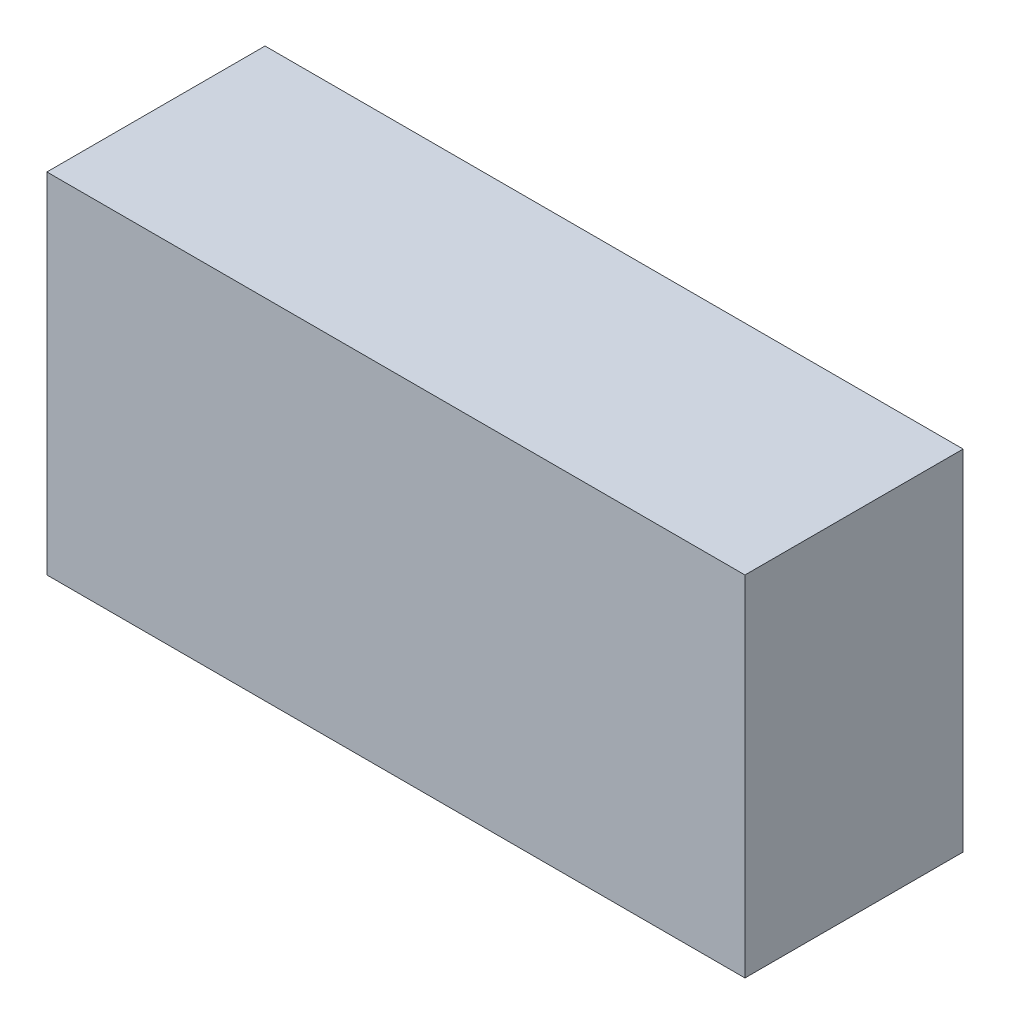
ISO-10303-21;
HEADER;
FILE_DESCRIPTION(('STEP AP214'),'2;1');
FILE_NAME('part.step','',(''),(''),'','','');
FILE_SCHEMA(('AUTOMOTIVE_DESIGN { 1 0 10303 214 1 1 1 1 }'));
ENDSEC;
DATA;
#1=APPLICATION_CONTEXT('core data for automotive mechanical design processes');
#2=APPLICATION_PROTOCOL_DEFINITION('international standard','automotive_design',2000,#1);
#3=PRODUCT_CONTEXT('',#1,'mechanical');
#4=PRODUCT('Part','Part','',(#3));
#5=PRODUCT_RELATED_PRODUCT_CATEGORY('part','',(#4));
#6=PRODUCT_DEFINITION_FORMATION('','',#4);
#7=PRODUCT_DEFINITION_CONTEXT('part definition',#1,'design');
#8=PRODUCT_DEFINITION('design','',#6,#7);
#9=PRODUCT_DEFINITION_SHAPE('','',#8);
#10=(LENGTH_UNIT() NAMED_UNIT(*) SI_UNIT(.MILLI.,.METRE.));
#11=(NAMED_UNIT(*) PLANE_ANGLE_UNIT() SI_UNIT($,.RADIAN.));
#12=(NAMED_UNIT(*) SI_UNIT($,.STERADIAN.) SOLID_ANGLE_UNIT());
#13=UNCERTAINTY_MEASURE_WITH_UNIT(LENGTH_MEASURE(1.E-05),#10,'distance_accuracy_value','');
#14=(GEOMETRIC_REPRESENTATION_CONTEXT(3) GLOBAL_UNCERTAINTY_ASSIGNED_CONTEXT((#13)) GLOBAL_UNIT_ASSIGNED_CONTEXT((#10,
#11,#12)) REPRESENTATION_CONTEXT('',''));
#15=CARTESIAN_POINT('',(0.,0.,0.));
#16=DIRECTION('',(0.,0.,1.));
#17=DIRECTION('',(1.,0.,0.));
#18=AXIS2_PLACEMENT_3D('',#15,#16,#17);
#19=CARTESIAN_POINT('',(0.8,0.4,0.5));
#20=DIRECTION('',(-1.,0.,0.));
#21=DIRECTION('',(0.,0.,1.));
#22=AXIS2_PLACEMENT_3D('',#19,#20,#21);
#23=PLANE('',#22);
#24=DIRECTION('',(0.,1.,0.));
#25=VECTOR('',#24,1.);
#26=CARTESIAN_POINT('',(0.8,0.4,0.));
#27=LINE('',#26,#25);
#28=CARTESIAN_POINT('',(0.8,-0.4,0.));
#29=VERTEX_POINT('',#28);
#30=CARTESIAN_POINT('',(0.8,0.4,0.));
#31=VERTEX_POINT('',#30);
#32=EDGE_CURVE('E96',#29,#31,#27,.T.);
#33=ORIENTED_EDGE('',*,*,#32,.T.);
#34=DIRECTION('',(0.,0.,-1.));
#35=VECTOR('',#34,1.);
#36=CARTESIAN_POINT('',(0.8,0.4,0.5));
#37=LINE('',#36,#35);
#38=CARTESIAN_POINT('',(0.8,0.4,0.5));
#39=VERTEX_POINT('',#38);
#40=EDGE_CURVE('E11',#39,#31,#37,.T.);
#41=ORIENTED_EDGE('',*,*,#40,.F.);
#42=DIRECTION('',(0.,1.,0.));
#43=VECTOR('',#42,1.);
#44=CARTESIAN_POINT('',(0.8,0.4,0.5));
#45=LINE('',#44,#43);
#46=CARTESIAN_POINT('',(0.8,-0.4,0.5));
#47=VERTEX_POINT('',#46);
#48=EDGE_CURVE('E84',#47,#39,#45,.T.);
#49=ORIENTED_EDGE('',*,*,#48,.F.);
#50=DIRECTION('',(0.,0.,-1.));
#51=VECTOR('',#50,1.);
#52=CARTESIAN_POINT('',(0.8,-0.4,0.5));
#53=LINE('',#52,#51);
#54=EDGE_CURVE('E92',#47,#29,#53,.T.);
#55=ORIENTED_EDGE('',*,*,#54,.T.);
#56=EDGE_LOOP('',(#33,#41,#49,#55));
#57=FACE_BOUND('',#56,.T.);
#58=ADVANCED_FACE('F33',(#57),#23,.F.);
#59=CARTESIAN_POINT('',(-0.8,0.4,0.5));
#60=DIRECTION('',(0.,-1.,0.));
#61=DIRECTION('',(0.,0.,-1.));
#62=AXIS2_PLACEMENT_3D('',#59,#60,#61);
#63=PLANE('',#62);
#64=DIRECTION('',(-1.,0.,0.));
#65=VECTOR('',#64,1.);
#66=CARTESIAN_POINT('',(-0.8,0.4,0.));
#67=LINE('',#66,#65);
#68=CARTESIAN_POINT('',(-0.8,0.4,0.));
#69=VERTEX_POINT('',#68);
#70=EDGE_CURVE('E88',#31,#69,#67,.T.);
#71=ORIENTED_EDGE('',*,*,#70,.T.);
#72=DIRECTION('',(0.,0.,-1.));
#73=VECTOR('',#72,1.);
#74=CARTESIAN_POINT('',(-0.8,0.4,0.5));
#75=LINE('',#74,#73);
#76=CARTESIAN_POINT('',(-0.8,0.4,0.5));
#77=VERTEX_POINT('',#76);
#78=EDGE_CURVE('E41',#77,#69,#75,.T.);
#79=ORIENTED_EDGE('',*,*,#78,.F.);
#80=DIRECTION('',(-1.,0.,0.));
#81=VECTOR('',#80,1.);
#82=CARTESIAN_POINT('',(-0.8,0.4,0.5));
#83=LINE('',#82,#81);
#84=EDGE_CURVE('E79',#39,#77,#83,.T.);
#85=ORIENTED_EDGE('',*,*,#84,.F.);
#86=ORIENTED_EDGE('',*,*,#40,.T.);
#87=EDGE_LOOP('',(#71,#79,#85,#86));
#88=FACE_BOUND('',#87,.T.);
#89=ADVANCED_FACE('F87',(#88),#63,.F.);
#90=CARTESIAN_POINT('',(-0.8,0.4,0.5));
#91=DIRECTION('',(1.,0.,0.));
#92=DIRECTION('',(0.,1.,0.));
#93=AXIS2_PLACEMENT_3D('',#90,#91,#92);
#94=PLANE('',#93);
#95=DIRECTION('',(0.,-1.,0.));
#96=VECTOR('',#95,1.);
#97=CARTESIAN_POINT('',(-0.8,0.4,0.));
#98=LINE('',#97,#96);
#99=CARTESIAN_POINT('',(-0.8,-0.4,0.));
#100=VERTEX_POINT('',#99);
#101=EDGE_CURVE('E66',#69,#100,#98,.T.);
#102=ORIENTED_EDGE('',*,*,#101,.T.);
#103=DIRECTION('',(0.,0.,-1.));
#104=VECTOR('',#103,1.);
#105=CARTESIAN_POINT('',(-0.8,-0.4,0.5));
#106=LINE('',#105,#104);
#107=CARTESIAN_POINT('',(-0.8,-0.4,0.5));
#108=VERTEX_POINT('',#107);
#109=EDGE_CURVE('E89',#108,#100,#106,.T.);
#110=ORIENTED_EDGE('',*,*,#109,.F.);
#111=DIRECTION('',(0.,-1.,0.));
#112=VECTOR('',#111,1.);
#113=CARTESIAN_POINT('',(-0.8,0.4,0.5));
#114=LINE('',#113,#112);
#115=EDGE_CURVE('E82',#77,#108,#114,.T.);
#116=ORIENTED_EDGE('',*,*,#115,.F.);
#117=ORIENTED_EDGE('',*,*,#78,.T.);
#118=EDGE_LOOP('',(#102,#110,#116,#117));
#119=FACE_BOUND('',#118,.T.);
#120=ADVANCED_FACE('F90',(#119),#94,.F.);
#121=CARTESIAN_POINT('',(-0.8,-0.4,0.5));
#122=DIRECTION('',(0.,1.,0.));
#123=DIRECTION('',(0.,0.,1.));
#124=AXIS2_PLACEMENT_3D('',#121,#122,#123);
#125=PLANE('',#124);
#126=DIRECTION('',(1.,0.,0.));
#127=VECTOR('',#126,1.);
#128=CARTESIAN_POINT('',(-0.8,-0.4,0.));
#129=LINE('',#128,#127);
#130=EDGE_CURVE('E72',#100,#29,#129,.T.);
#131=ORIENTED_EDGE('',*,*,#130,.T.);
#132=ORIENTED_EDGE('',*,*,#54,.F.);
#133=DIRECTION('',(1.,0.,0.));
#134=VECTOR('',#133,1.);
#135=CARTESIAN_POINT('',(-0.8,-0.4,0.5));
#136=LINE('',#135,#134);
#137=EDGE_CURVE('E49',#108,#47,#136,.T.);
#138=ORIENTED_EDGE('',*,*,#137,.F.);
#139=ORIENTED_EDGE('',*,*,#109,.T.);
#140=EDGE_LOOP('',(#131,#132,#138,#139));
#141=FACE_BOUND('',#140,.T.);
#142=ADVANCED_FACE('F103',(#141),#125,.F.);
#143=CARTESIAN_POINT('',(0.,0.,0.5));
#144=DIRECTION('',(0.,0.,1.));
#145=DIRECTION('',(1.,0.,0.));
#146=AXIS2_PLACEMENT_3D('',#143,#144,#145);
#147=PLANE('',#146);
#148=ORIENTED_EDGE('',*,*,#48,.T.);
#149=ORIENTED_EDGE('',*,*,#84,.T.);
#150=ORIENTED_EDGE('',*,*,#115,.T.);
#151=ORIENTED_EDGE('',*,*,#137,.T.);
#152=EDGE_LOOP('',(#148,#149,#150,#151));
#153=FACE_BOUND('',#152,.T.);
#154=ADVANCED_FACE('F80',(#153),#147,.T.);
#155=CARTESIAN_POINT('',(0.,0.,0.));
#156=DIRECTION('',(0.,0.,1.));
#157=DIRECTION('',(1.,0.,0.));
#158=AXIS2_PLACEMENT_3D('',#155,#156,#157);
#159=PLANE('',#158);
#160=ORIENTED_EDGE('',*,*,#32,.F.);
#161=ORIENTED_EDGE('',*,*,#130,.F.);
#162=ORIENTED_EDGE('',*,*,#101,.F.);
#163=ORIENTED_EDGE('',*,*,#70,.F.);
#164=EDGE_LOOP('',(#160,#161,#162,#163));
#165=FACE_BOUND('',#164,.T.);
#166=ADVANCED_FACE('F106',(#165),#159,.F.);
#167=CLOSED_SHELL('',(#58,#89,#120,#142,#154,#166));
#168=MANIFOLD_SOLID_BREP('B2',#167);
#169=ADVANCED_BREP_SHAPE_REPRESENTATION('',(#18,#168),#14);
#170=SHAPE_DEFINITION_REPRESENTATION(#9,#169);
ENDSEC;
END-ISO-10303-21;
